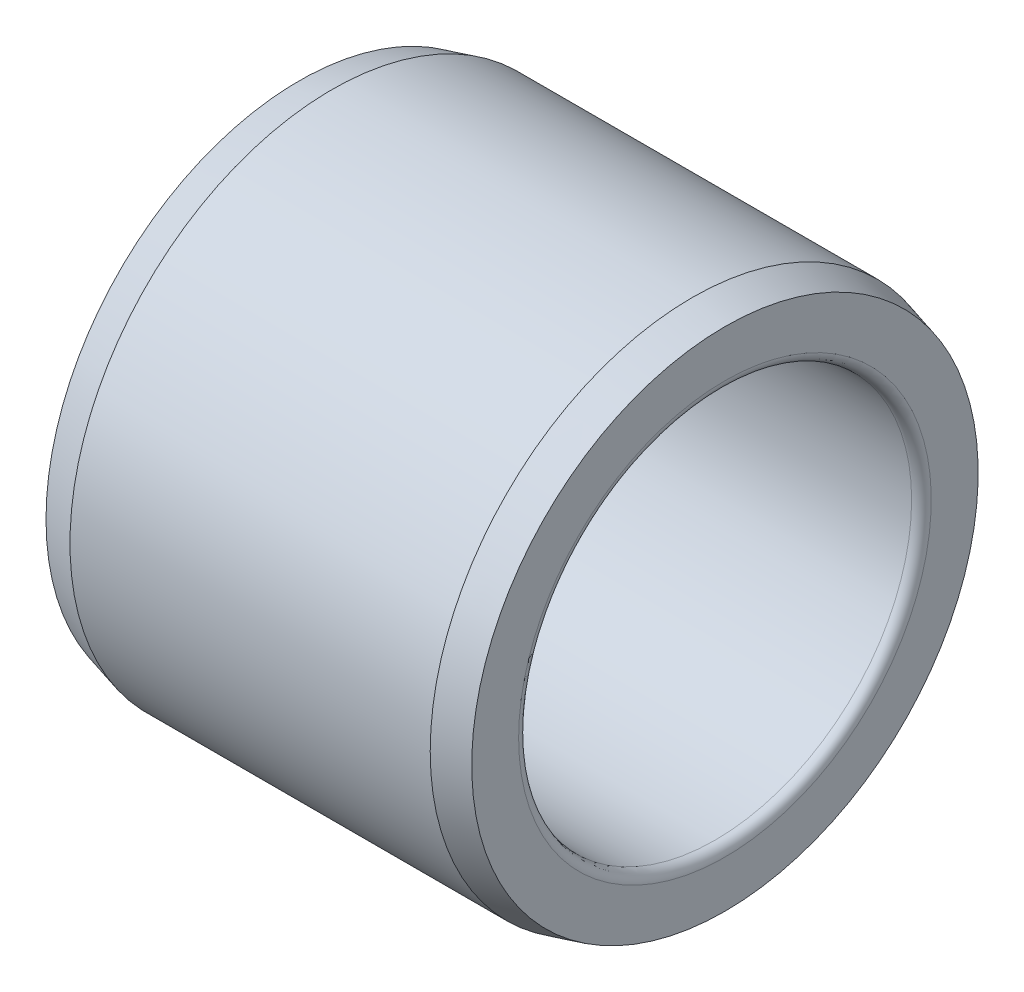
ISO-10303-21;
HEADER;
FILE_DESCRIPTION(('STEP AP214'),'2;1');
FILE_NAME('part.step','',(''),(''),'','','');
FILE_SCHEMA(('AUTOMOTIVE_DESIGN { 1 0 10303 214 1 1 1 1 }'));
ENDSEC;
DATA;
#1=APPLICATION_CONTEXT('core data for automotive mechanical design processes');
#2=APPLICATION_PROTOCOL_DEFINITION('international standard','automotive_design',2000,#1);
#3=PRODUCT_CONTEXT('',#1,'mechanical');
#4=PRODUCT('Part','Part','',(#3));
#5=PRODUCT_RELATED_PRODUCT_CATEGORY('part','',(#4));
#6=PRODUCT_DEFINITION_FORMATION('','',#4);
#7=PRODUCT_DEFINITION_CONTEXT('part definition',#1,'design');
#8=PRODUCT_DEFINITION('design','',#6,#7);
#9=PRODUCT_DEFINITION_SHAPE('','',#8);
#10=(LENGTH_UNIT() NAMED_UNIT(*) SI_UNIT(.MILLI.,.METRE.));
#11=(NAMED_UNIT(*) PLANE_ANGLE_UNIT() SI_UNIT($,.RADIAN.));
#12=(NAMED_UNIT(*) SI_UNIT($,.STERADIAN.) SOLID_ANGLE_UNIT());
#13=UNCERTAINTY_MEASURE_WITH_UNIT(LENGTH_MEASURE(1.E-05),#10,'distance_accuracy_value','');
#14=(GEOMETRIC_REPRESENTATION_CONTEXT(3) GLOBAL_UNCERTAINTY_ASSIGNED_CONTEXT((#13)) GLOBAL_UNIT_ASSIGNED_CONTEXT((#10,
#11,#12)) REPRESENTATION_CONTEXT('',''));
#15=CARTESIAN_POINT('',(0.,0.,0.));
#16=DIRECTION('',(0.,0.,1.));
#17=DIRECTION('',(1.,0.,0.));
#18=AXIS2_PLACEMENT_3D('',#15,#16,#17);
#19=CARTESIAN_POINT('',(0.299999999999999,0.,0.));
#20=DIRECTION('',(1.,0.,0.));
#21=DIRECTION('',(0.,0.,-1.));
#22=AXIS2_PLACEMENT_3D('',#19,#20,#21);
#23=CYLINDRICAL_SURFACE('',#22,6.);
#24=CARTESIAN_POINT('',(0.299999999999999,0.,0.));
#25=DIRECTION('',(1.,0.,0.));
#26=DIRECTION('',(0.,1.,0.));
#27=AXIS2_PLACEMENT_3D('',#24,#25,#26);
#28=CIRCLE('',#27,6.);
#29=CARTESIAN_POINT('',(0.299999999999999,6.,0.));
#30=VERTEX_POINT('',#29);
#31=EDGE_CURVE('E36',#30,#30,#28,.T.);
#32=ORIENTED_EDGE('',*,*,#31,.F.);
#33=EDGE_LOOP('',(#32));
#34=FACE_BOUND('',#33,.T.);
#35=CARTESIAN_POINT('',(12.7,0.,0.));
#36=DIRECTION('',(1.,0.,0.));
#37=DIRECTION('',(0.,1.,0.));
#38=AXIS2_PLACEMENT_3D('',#35,#36,#37);
#39=CIRCLE('',#38,6.);
#40=CARTESIAN_POINT('',(12.7,6.,0.));
#41=VERTEX_POINT('',#40);
#42=EDGE_CURVE('E68',#41,#41,#39,.F.);
#43=ORIENTED_EDGE('',*,*,#42,.F.);
#44=EDGE_LOOP('',(#43));
#45=FACE_BOUND('',#44,.T.);
#46=ADVANCED_FACE('F14',(#34,#45),#23,.F.);
#47=CARTESIAN_POINT('',(0.299999999999999,0.,0.));
#48=DIRECTION('',(1.,0.,0.));
#49=DIRECTION('',(0.,1.,0.));
#50=AXIS2_PLACEMENT_3D('',#47,#48,#49);
#51=TOROIDAL_SURFACE('',#50,6.3,0.299999999999999);
#52=ORIENTED_EDGE('',*,*,#31,.T.);
#53=EDGE_LOOP('',(#52));
#54=FACE_BOUND('',#53,.T.);
#55=CARTESIAN_POINT('',(0.,0.,0.));
#56=DIRECTION('',(-1.,0.,0.));
#57=DIRECTION('',(0.,0.,1.));
#58=AXIS2_PLACEMENT_3D('',#55,#56,#57);
#59=CIRCLE('',#58,6.3);
#60=CARTESIAN_POINT('',(0.,0.,6.3));
#61=VERTEX_POINT('',#60);
#62=EDGE_CURVE('E63',#61,#61,#59,.F.);
#63=ORIENTED_EDGE('',*,*,#62,.F.);
#64=EDGE_LOOP('',(#63));
#65=FACE_BOUND('',#64,.T.);
#66=ADVANCED_FACE('F38',(#54,#65),#51,.T.);
#67=CARTESIAN_POINT('',(12.7,0.,0.));
#68=DIRECTION('',(1.,0.,0.));
#69=DIRECTION('',(0.,1.,0.));
#70=AXIS2_PLACEMENT_3D('',#67,#68,#69);
#71=TOROIDAL_SURFACE('',#70,6.3,0.300000000000001);
#72=CARTESIAN_POINT('',(13.,0.,0.));
#73=DIRECTION('',(1.,0.,0.));
#74=DIRECTION('',(0.,0.,1.));
#75=AXIS2_PLACEMENT_3D('',#72,#73,#74);
#76=CIRCLE('',#75,6.3);
#77=CARTESIAN_POINT('',(13.,0.,6.3));
#78=VERTEX_POINT('',#77);
#79=EDGE_CURVE('E59',#78,#78,#76,.F.);
#80=ORIENTED_EDGE('',*,*,#79,.F.);
#81=EDGE_LOOP('',(#80));
#82=FACE_BOUND('',#81,.T.);
#83=ORIENTED_EDGE('',*,*,#42,.T.);
#84=EDGE_LOOP('',(#83));
#85=FACE_BOUND('',#84,.T.);
#86=ADVANCED_FACE('F41',(#82,#85),#71,.T.);
#87=CARTESIAN_POINT('',(0.,0.,7.016025));
#88=DIRECTION('',(-1.,0.,0.));
#89=DIRECTION('',(0.,0.,1.));
#90=AXIS2_PLACEMENT_3D('',#87,#88,#89);
#91=PLANE('',#90);
#92=ORIENTED_EDGE('',*,*,#62,.T.);
#93=EDGE_LOOP('',(#92));
#94=FACE_BOUND('',#93,.T.);
#95=CARTESIAN_POINT('',(0.,0.,0.));
#96=DIRECTION('',(1.,0.,0.));
#97=DIRECTION('',(0.,0.,-1.));
#98=AXIS2_PLACEMENT_3D('',#95,#96,#97);
#99=CIRCLE('',#98,7.73205);
#100=CARTESIAN_POINT('',(0.,0.,-7.73205));
#101=VERTEX_POINT('',#100);
#102=EDGE_CURVE('E17',#101,#101,#99,.T.);
#103=ORIENTED_EDGE('',*,*,#102,.F.);
#104=EDGE_LOOP('',(#103));
#105=FACE_BOUND('',#104,.T.);
#106=ADVANCED_FACE('F79',(#94,#105),#91,.T.);
#107=CARTESIAN_POINT('',(13.,0.,7.016025));
#108=DIRECTION('',(1.,0.,0.));
#109=DIRECTION('',(0.,0.,-1.));
#110=AXIS2_PLACEMENT_3D('',#107,#108,#109);
#111=PLANE('',#110);
#112=CARTESIAN_POINT('',(13.,0.,0.));
#113=DIRECTION('',(-1.,0.,0.));
#114=DIRECTION('',(0.,-1.,0.));
#115=AXIS2_PLACEMENT_3D('',#112,#113,#114);
#116=CIRCLE('',#115,7.73205);
#117=CARTESIAN_POINT('',(13.,-7.73205,0.));
#118=VERTEX_POINT('',#117);
#119=EDGE_CURVE('E26',#118,#118,#116,.T.);
#120=ORIENTED_EDGE('',*,*,#119,.F.);
#121=EDGE_LOOP('',(#120));
#122=FACE_BOUND('',#121,.T.);
#123=ORIENTED_EDGE('',*,*,#79,.T.);
#124=EDGE_LOOP('',(#123));
#125=FACE_BOUND('',#124,.T.);
#126=ADVANCED_FACE('F84',(#122,#125),#111,.T.);
#127=CARTESIAN_POINT('',(1.,0.,0.));
#128=DIRECTION('',(1.,0.,0.));
#129=DIRECTION('',(0.,0.,-1.));
#130=AXIS2_PLACEMENT_3D('',#127,#128,#129);
#131=CONICAL_SURFACE('',#130,8.,0.261800141271017);
#132=ORIENTED_EDGE('',*,*,#102,.T.);
#133=EDGE_LOOP('',(#132));
#134=FACE_BOUND('',#133,.T.);
#135=CARTESIAN_POINT('',(1.,0.,0.));
#136=DIRECTION('',(1.,0.,0.));
#137=DIRECTION('',(0.,0.,-1.));
#138=AXIS2_PLACEMENT_3D('',#135,#136,#137);
#139=CIRCLE('',#138,8.);
#140=CARTESIAN_POINT('',(1.,0.,-8.));
#141=VERTEX_POINT('',#140);
#142=EDGE_CURVE('E21',#141,#141,#139,.T.);
#143=ORIENTED_EDGE('',*,*,#142,.F.);
#144=EDGE_LOOP('',(#143));
#145=FACE_BOUND('',#144,.T.);
#146=ADVANCED_FACE('F93',(#134,#145),#131,.T.);
#147=CARTESIAN_POINT('',(12.,0.,0.));
#148=DIRECTION('',(-1.,0.,0.));
#149=DIRECTION('',(0.,-1.,0.));
#150=AXIS2_PLACEMENT_3D('',#147,#148,#149);
#151=CONICAL_SURFACE('',#150,8.,0.261800141271017);
#152=ORIENTED_EDGE('',*,*,#119,.T.);
#153=EDGE_LOOP('',(#152));
#154=FACE_BOUND('',#153,.T.);
#155=CARTESIAN_POINT('',(12.,0.,0.));
#156=DIRECTION('',(1.,0.,0.));
#157=DIRECTION('',(0.,0.,-1.));
#158=AXIS2_PLACEMENT_3D('',#155,#156,#157);
#159=CIRCLE('',#158,8.);
#160=CARTESIAN_POINT('',(12.,0.,-8.));
#161=VERTEX_POINT('',#160);
#162=EDGE_CURVE('E10',#161,#161,#159,.F.);
#163=ORIENTED_EDGE('',*,*,#162,.F.);
#164=EDGE_LOOP('',(#163));
#165=FACE_BOUND('',#164,.T.);
#166=ADVANCED_FACE('F87',(#154,#165),#151,.T.);
#167=CARTESIAN_POINT('',(6.5,0.,0.));
#168=DIRECTION('',(1.,0.,0.));
#169=DIRECTION('',(0.,0.,-1.));
#170=AXIS2_PLACEMENT_3D('',#167,#168,#169);
#171=CYLINDRICAL_SURFACE('',#170,8.);
#172=ORIENTED_EDGE('',*,*,#142,.T.);
#173=EDGE_LOOP('',(#172));
#174=FACE_BOUND('',#173,.T.);
#175=ORIENTED_EDGE('',*,*,#162,.T.);
#176=EDGE_LOOP('',(#175));
#177=FACE_BOUND('',#176,.T.);
#178=ADVANCED_FACE('F85',(#174,#177),#171,.T.);
#179=CLOSED_SHELL('',(#46,#66,#86,#106,#126,#146,#166,#178));
#180=MANIFOLD_SOLID_BREP('B1',#179);
#181=ADVANCED_BREP_SHAPE_REPRESENTATION('',(#18,#180),#14);
#182=SHAPE_DEFINITION_REPRESENTATION(#9,#181);
ENDSEC;
END-ISO-10303-21;
